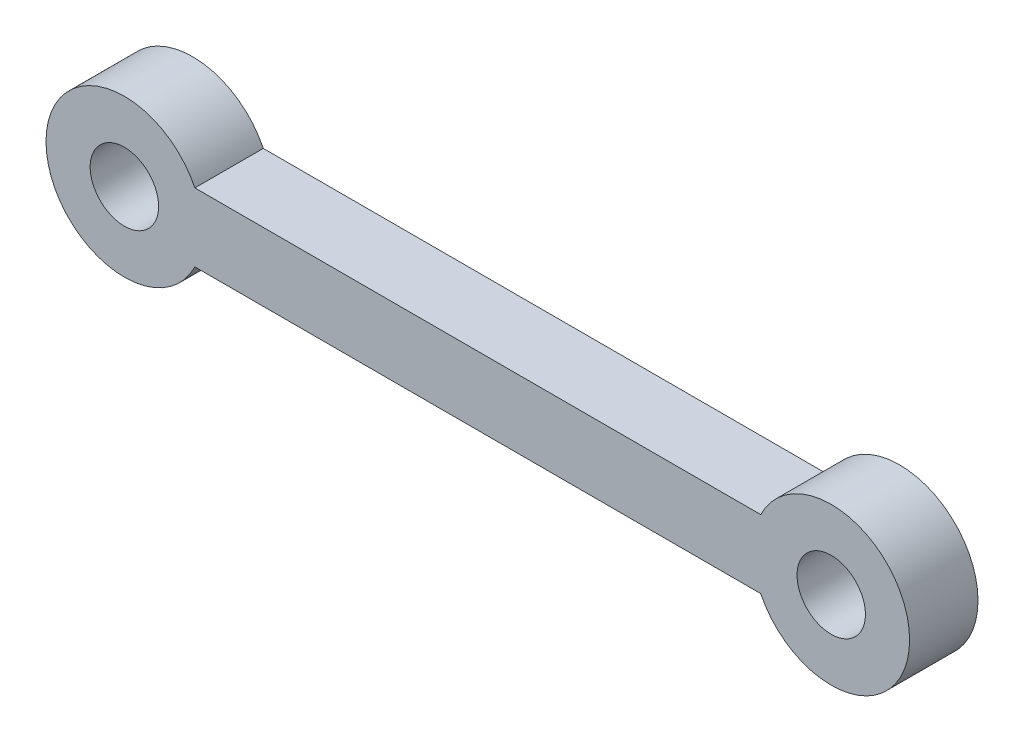
ISO-10303-21;
HEADER;
FILE_DESCRIPTION(('STEP AP214'),'2;1');
FILE_NAME('part.step','',(''),(''),'','','');
FILE_SCHEMA(('AUTOMOTIVE_DESIGN { 1 0 10303 214 1 1 1 1 }'));
ENDSEC;
DATA;
#1=APPLICATION_CONTEXT('core data for automotive mechanical design processes');
#2=APPLICATION_PROTOCOL_DEFINITION('international standard','automotive_design',2000,#1);
#3=PRODUCT_CONTEXT('',#1,'mechanical');
#4=PRODUCT('Part','Part','',(#3));
#5=PRODUCT_RELATED_PRODUCT_CATEGORY('part','',(#4));
#6=PRODUCT_DEFINITION_FORMATION('','',#4);
#7=PRODUCT_DEFINITION_CONTEXT('part definition',#1,'design');
#8=PRODUCT_DEFINITION('design','',#6,#7);
#9=PRODUCT_DEFINITION_SHAPE('','',#8);
#10=(LENGTH_UNIT() NAMED_UNIT(*) SI_UNIT(.MILLI.,.METRE.));
#11=(NAMED_UNIT(*) PLANE_ANGLE_UNIT() SI_UNIT($,.RADIAN.));
#12=(NAMED_UNIT(*) SI_UNIT($,.STERADIAN.) SOLID_ANGLE_UNIT());
#13=UNCERTAINTY_MEASURE_WITH_UNIT(LENGTH_MEASURE(1.E-05),#10,'distance_accuracy_value','');
#14=(GEOMETRIC_REPRESENTATION_CONTEXT(3) GLOBAL_UNCERTAINTY_ASSIGNED_CONTEXT((#13)) GLOBAL_UNIT_ASSIGNED_CONTEXT((#10,
#11,#12)) REPRESENTATION_CONTEXT('',''));
#15=CARTESIAN_POINT('',(0.,0.,0.));
#16=DIRECTION('',(0.,0.,1.));
#17=DIRECTION('',(1.,0.,0.));
#18=AXIS2_PLACEMENT_3D('',#15,#16,#17);
#19=CARTESIAN_POINT('',(0.,1.5,3.));
#20=DIRECTION('',(0.,1.,0.));
#21=DIRECTION('',(0.,0.,1.));
#22=AXIS2_PLACEMENT_3D('',#19,#20,#21);
#23=PLANE('',#22);
#24=DIRECTION('',(1.,0.,0.));
#25=VECTOR('',#24,1.);
#26=CARTESIAN_POINT('',(0.,1.5,0.));
#27=LINE('',#26,#25);
#28=CARTESIAN_POINT('',(-11.013862330325,1.5,0.));
#29=VERTEX_POINT('',#28);
#30=CARTESIAN_POINT('',(13.8022221186847,1.5,0.));
#31=VERTEX_POINT('',#30);
#32=EDGE_CURVE('E118',#29,#31,#27,.T.);
#33=ORIENTED_EDGE('',*,*,#32,.F.);
#34=DIRECTION('',(0.,0.,-1.));
#35=VECTOR('',#34,1.);
#36=CARTESIAN_POINT('',(-11.013862330325,1.5,3.));
#37=LINE('',#36,#35);
#38=CARTESIAN_POINT('',(-11.013862330325,1.5,3.));
#39=VERTEX_POINT('',#38);
#40=EDGE_CURVE('E11',#39,#29,#37,.T.);
#41=ORIENTED_EDGE('',*,*,#40,.F.);
#42=DIRECTION('',(1.,0.,0.));
#43=VECTOR('',#42,1.);
#44=CARTESIAN_POINT('',(0.,1.5,3.));
#45=LINE('',#44,#43);
#46=CARTESIAN_POINT('',(13.8022221186847,1.5,3.));
#47=VERTEX_POINT('',#46);
#48=EDGE_CURVE('E91',#39,#47,#45,.T.);
#49=ORIENTED_EDGE('',*,*,#48,.T.);
#50=DIRECTION('',(0.,0.,-1.));
#51=VECTOR('',#50,1.);
#52=CARTESIAN_POINT('',(13.8022221186847,1.5,3.));
#53=LINE('',#52,#51);
#54=EDGE_CURVE('E58',#47,#31,#53,.T.);
#55=ORIENTED_EDGE('',*,*,#54,.T.);
#56=EDGE_LOOP('',(#33,#41,#49,#55));
#57=FACE_BOUND('',#56,.T.);
#58=ADVANCED_FACE('F41',(#57),#23,.T.);
#59=CARTESIAN_POINT('',(-14.1058201058201,0.,3.));
#60=DIRECTION('',(0.,0.,-1.));
#61=DIRECTION('',(-1.,0.,0.));
#62=AXIS2_PLACEMENT_3D('',#59,#60,#61);
#63=CYLINDRICAL_SURFACE('',#62,3.43659757397412);
#64=CARTESIAN_POINT('',(-14.1058201058201,0.,0.));
#65=DIRECTION('',(0.,0.,1.));
#66=DIRECTION('',(1.,0.,0.));
#67=AXIS2_PLACEMENT_3D('',#64,#65,#66);
#68=CIRCLE('',#67,3.43659757397412);
#69=CARTESIAN_POINT('',(-11.013862330325,-1.5,0.));
#70=VERTEX_POINT('',#69);
#71=EDGE_CURVE('E98',#29,#70,#68,.T.);
#72=ORIENTED_EDGE('',*,*,#71,.T.);
#73=DIRECTION('',(0.,0.,-1.));
#74=VECTOR('',#73,1.);
#75=CARTESIAN_POINT('',(-11.013862330325,-1.5,3.));
#76=LINE('',#75,#74);
#77=CARTESIAN_POINT('',(-11.013862330325,-1.5,3.));
#78=VERTEX_POINT('',#77);
#79=EDGE_CURVE('E50',#78,#70,#76,.T.);
#80=ORIENTED_EDGE('',*,*,#79,.F.);
#81=CARTESIAN_POINT('',(-14.1058201058201,0.,3.));
#82=DIRECTION('',(0.,0.,1.));
#83=DIRECTION('',(1.,0.,0.));
#84=AXIS2_PLACEMENT_3D('',#81,#82,#83);
#85=CIRCLE('',#84,3.43659757397412);
#86=EDGE_CURVE('E84',#39,#78,#85,.T.);
#87=ORIENTED_EDGE('',*,*,#86,.F.);
#88=ORIENTED_EDGE('',*,*,#40,.T.);
#89=EDGE_LOOP('',(#72,#80,#87,#88));
#90=FACE_BOUND('',#89,.T.);
#91=ADVANCED_FACE('F96',(#90),#63,.T.);
#92=CARTESIAN_POINT('',(0.,-1.5,3.));
#93=DIRECTION('',(0.,1.,0.));
#94=DIRECTION('',(0.,0.,1.));
#95=AXIS2_PLACEMENT_3D('',#92,#93,#94);
#96=PLANE('',#95);
#97=DIRECTION('',(1.,0.,0.));
#98=VECTOR('',#97,1.);
#99=CARTESIAN_POINT('',(0.,-1.5,0.));
#100=LINE('',#99,#98);
#101=CARTESIAN_POINT('',(13.8022221186848,-1.5,0.));
#102=VERTEX_POINT('',#101);
#103=EDGE_CURVE('E123',#70,#102,#100,.T.);
#104=ORIENTED_EDGE('',*,*,#103,.T.);
#105=DIRECTION('',(0.,0.,-1.));
#106=VECTOR('',#105,1.);
#107=CARTESIAN_POINT('',(13.8022221186848,-1.5,3.));
#108=LINE('',#107,#106);
#109=CARTESIAN_POINT('',(13.8022221186848,-1.5,3.));
#110=VERTEX_POINT('',#109);
#111=EDGE_CURVE('E72',#110,#102,#108,.T.);
#112=ORIENTED_EDGE('',*,*,#111,.F.);
#113=DIRECTION('',(1.,0.,0.));
#114=VECTOR('',#113,1.);
#115=CARTESIAN_POINT('',(0.,-1.5,3.));
#116=LINE('',#115,#114);
#117=EDGE_CURVE('E90',#78,#110,#116,.T.);
#118=ORIENTED_EDGE('',*,*,#117,.F.);
#119=ORIENTED_EDGE('',*,*,#79,.T.);
#120=EDGE_LOOP('',(#104,#112,#118,#119));
#121=FACE_BOUND('',#120,.T.);
#122=ADVANCED_FACE('F102',(#121),#96,.F.);
#123=CARTESIAN_POINT('',(-14.1058201058201,0.,3.));
#124=DIRECTION('',(0.,0.,-1.));
#125=DIRECTION('',(-1.,0.,0.));
#126=AXIS2_PLACEMENT_3D('',#123,#124,#125);
#127=CYLINDRICAL_SURFACE('',#126,1.5);
#128=CARTESIAN_POINT('',(-14.1058201058201,0.,3.));
#129=DIRECTION('',(0.,0.,1.));
#130=DIRECTION('',(1.,0.,0.));
#131=AXIS2_PLACEMENT_3D('',#128,#129,#130);
#132=CIRCLE('',#131,1.5);
#133=CARTESIAN_POINT('',(-12.6058201058201,0.,3.));
#134=VERTEX_POINT('',#133);
#135=EDGE_CURVE('E107',#134,#134,#132,.T.);
#136=ORIENTED_EDGE('',*,*,#135,.T.);
#137=EDGE_LOOP('',(#136));
#138=FACE_BOUND('',#137,.T.);
#139=CARTESIAN_POINT('',(-14.1058201058201,0.,0.));
#140=DIRECTION('',(0.,0.,1.));
#141=DIRECTION('',(1.,0.,0.));
#142=AXIS2_PLACEMENT_3D('',#139,#140,#141);
#143=CIRCLE('',#142,1.5);
#144=CARTESIAN_POINT('',(-12.6058201058201,0.,0.));
#145=VERTEX_POINT('',#144);
#146=EDGE_CURVE('E130',#145,#145,#143,.T.);
#147=ORIENTED_EDGE('',*,*,#146,.F.);
#148=EDGE_LOOP('',(#147));
#149=FACE_BOUND('',#148,.T.);
#150=ADVANCED_FACE('F147',(#138,#149),#127,.F.);
#151=CARTESIAN_POINT('',(16.8941798941799,0.,3.));
#152=DIRECTION('',(0.,0.,-1.));
#153=DIRECTION('',(-1.,0.,0.));
#154=AXIS2_PLACEMENT_3D('',#151,#152,#153);
#155=CYLINDRICAL_SURFACE('',#154,3.43659757397413);
#156=CARTESIAN_POINT('',(16.8941798941799,0.,0.));
#157=DIRECTION('',(0.,0.,1.));
#158=DIRECTION('',(1.,0.,0.));
#159=AXIS2_PLACEMENT_3D('',#156,#157,#158);
#160=CIRCLE('',#159,3.43659757397413);
#161=EDGE_CURVE('E126',#31,#102,#160,.F.);
#162=ORIENTED_EDGE('',*,*,#161,.F.);
#163=ORIENTED_EDGE('',*,*,#54,.F.);
#164=CARTESIAN_POINT('',(16.8941798941799,0.,3.));
#165=DIRECTION('',(0.,0.,1.));
#166=DIRECTION('',(1.,0.,0.));
#167=AXIS2_PLACEMENT_3D('',#164,#165,#166);
#168=CIRCLE('',#167,3.43659757397413);
#169=EDGE_CURVE('E104',#47,#110,#168,.F.);
#170=ORIENTED_EDGE('',*,*,#169,.T.);
#171=ORIENTED_EDGE('',*,*,#111,.T.);
#172=EDGE_LOOP('',(#162,#163,#170,#171));
#173=FACE_BOUND('',#172,.T.);
#174=ADVANCED_FACE('F144',(#173),#155,.T.);
#175=CARTESIAN_POINT('',(16.8941798941799,0.,3.));
#176=DIRECTION('',(0.,0.,-1.));
#177=DIRECTION('',(-1.,0.,0.));
#178=AXIS2_PLACEMENT_3D('',#175,#176,#177);
#179=CYLINDRICAL_SURFACE('',#178,1.5);
#180=CARTESIAN_POINT('',(16.8941798941799,0.,3.));
#181=DIRECTION('',(0.,0.,1.));
#182=DIRECTION('',(1.,0.,0.));
#183=AXIS2_PLACEMENT_3D('',#180,#181,#182);
#184=CIRCLE('',#183,1.5);
#185=CARTESIAN_POINT('',(18.3941798941799,0.,3.));
#186=VERTEX_POINT('',#185);
#187=EDGE_CURVE('E114',#186,#186,#184,.F.);
#188=ORIENTED_EDGE('',*,*,#187,.F.);
#189=EDGE_LOOP('',(#188));
#190=FACE_BOUND('',#189,.T.);
#191=CARTESIAN_POINT('',(16.8941798941799,0.,0.));
#192=DIRECTION('',(0.,0.,1.));
#193=DIRECTION('',(1.,0.,0.));
#194=AXIS2_PLACEMENT_3D('',#191,#192,#193);
#195=CIRCLE('',#194,1.5);
#196=CARTESIAN_POINT('',(18.3941798941799,0.,0.));
#197=VERTEX_POINT('',#196);
#198=EDGE_CURVE('E134',#197,#197,#195,.F.);
#199=ORIENTED_EDGE('',*,*,#198,.T.);
#200=EDGE_LOOP('',(#199));
#201=FACE_BOUND('',#200,.T.);
#202=ADVANCED_FACE('F146',(#190,#201),#179,.F.);
#203=CARTESIAN_POINT('',(0.,0.,3.));
#204=DIRECTION('',(0.,0.,1.));
#205=DIRECTION('',(1.,0.,0.));
#206=AXIS2_PLACEMENT_3D('',#203,#204,#205);
#207=PLANE('',#206);
#208=ORIENTED_EDGE('',*,*,#48,.F.);
#209=ORIENTED_EDGE('',*,*,#86,.T.);
#210=ORIENTED_EDGE('',*,*,#117,.T.);
#211=ORIENTED_EDGE('',*,*,#169,.F.);
#212=EDGE_LOOP('',(#208,#209,#210,#211));
#213=FACE_BOUND('',#212,.T.);
#214=ORIENTED_EDGE('',*,*,#135,.F.);
#215=EDGE_LOOP('',(#214));
#216=FACE_BOUND('',#215,.T.);
#217=ORIENTED_EDGE('',*,*,#187,.T.);
#218=EDGE_LOOP('',(#217));
#219=FACE_BOUND('',#218,.T.);
#220=ADVANCED_FACE('F86',(#213,#216,#219),#207,.T.);
#221=CARTESIAN_POINT('',(0.,0.,0.));
#222=DIRECTION('',(0.,0.,1.));
#223=DIRECTION('',(1.,0.,0.));
#224=AXIS2_PLACEMENT_3D('',#221,#222,#223);
#225=PLANE('',#224);
#226=ORIENTED_EDGE('',*,*,#32,.T.);
#227=ORIENTED_EDGE('',*,*,#161,.T.);
#228=ORIENTED_EDGE('',*,*,#103,.F.);
#229=ORIENTED_EDGE('',*,*,#71,.F.);
#230=EDGE_LOOP('',(#226,#227,#228,#229));
#231=FACE_BOUND('',#230,.T.);
#232=ORIENTED_EDGE('',*,*,#146,.T.);
#233=EDGE_LOOP('',(#232));
#234=FACE_BOUND('',#233,.T.);
#235=ORIENTED_EDGE('',*,*,#198,.F.);
#236=EDGE_LOOP('',(#235));
#237=FACE_BOUND('',#236,.T.);
#238=ADVANCED_FACE('F191',(#231,#234,#237),#225,.F.);
#239=CLOSED_SHELL('',(#58,#91,#122,#150,#174,#202,#220,#238));
#240=MANIFOLD_SOLID_BREP('B2',#239);
#241=ADVANCED_BREP_SHAPE_REPRESENTATION('',(#18,#240),#14);
#242=SHAPE_DEFINITION_REPRESENTATION(#9,#241);
ENDSEC;
END-ISO-10303-21;
